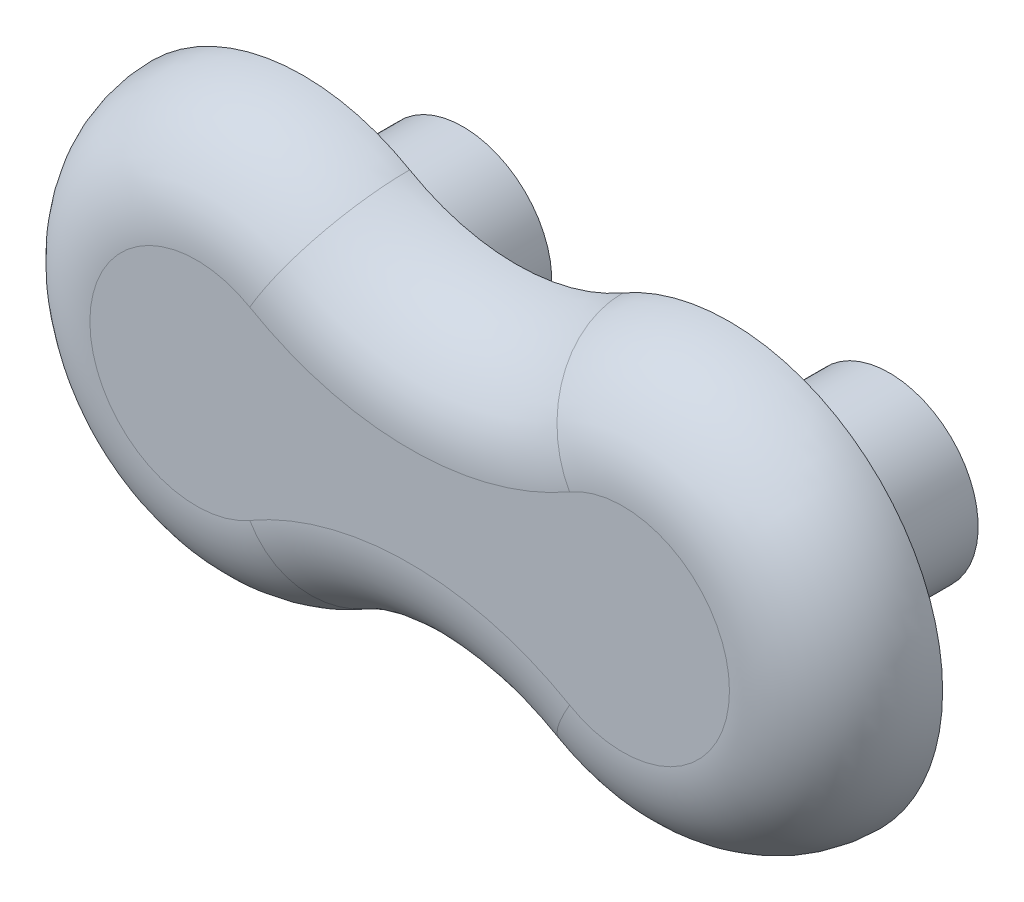
ISO-10303-21;
HEADER;
FILE_DESCRIPTION(('STEP AP214'),'2;1');
FILE_NAME('part.step','',(''),(''),'','','');
FILE_SCHEMA(('AUTOMOTIVE_DESIGN { 1 0 10303 214 1 1 1 1 }'));
ENDSEC;
DATA;
#1=APPLICATION_CONTEXT('core data for automotive mechanical design processes');
#2=APPLICATION_PROTOCOL_DEFINITION('international standard','automotive_design',2000,#1);
#3=PRODUCT_CONTEXT('',#1,'mechanical');
#4=PRODUCT('Part','Part','',(#3));
#5=PRODUCT_RELATED_PRODUCT_CATEGORY('part','',(#4));
#6=PRODUCT_DEFINITION_FORMATION('','',#4);
#7=PRODUCT_DEFINITION_CONTEXT('part definition',#1,'design');
#8=PRODUCT_DEFINITION('design','',#6,#7);
#9=PRODUCT_DEFINITION_SHAPE('','',#8);
#10=(LENGTH_UNIT() NAMED_UNIT(*) SI_UNIT(.MILLI.,.METRE.));
#11=(NAMED_UNIT(*) PLANE_ANGLE_UNIT() SI_UNIT($,.RADIAN.));
#12=(NAMED_UNIT(*) SI_UNIT($,.STERADIAN.) SOLID_ANGLE_UNIT());
#13=UNCERTAINTY_MEASURE_WITH_UNIT(LENGTH_MEASURE(1.E-05),#10,'distance_accuracy_value','');
#14=(GEOMETRIC_REPRESENTATION_CONTEXT(3) GLOBAL_UNCERTAINTY_ASSIGNED_CONTEXT((#13)) GLOBAL_UNIT_ASSIGNED_CONTEXT((#10,
#11,#12)) REPRESENTATION_CONTEXT('',''));
#15=CARTESIAN_POINT('',(0.,0.,0.));
#16=DIRECTION('',(0.,0.,1.));
#17=DIRECTION('',(1.,0.,0.));
#18=AXIS2_PLACEMENT_3D('',#15,#16,#17);
#19=CARTESIAN_POINT('',(15.,5.19615242270662,7.5));
#20=DIRECTION('',(0.,0.,1.));
#21=DIRECTION('',(1.,0.,0.));
#22=AXIS2_PLACEMENT_3D('',#19,#20,#21);
#23=PLANE('',#22);
#24=CARTESIAN_POINT('',(12.,10.3923048454133,7.5));
#25=DIRECTION('',(0.,0.,1.));
#26=DIRECTION('',(1.,0.,0.));
#27=AXIS2_PLACEMENT_3D('',#24,#25,#26);
#28=CIRCLE('',#27,9.);
#29=CARTESIAN_POINT('',(16.5,2.5980762113533,7.5));
#30=VERTEX_POINT('',#29);
#31=CARTESIAN_POINT('',(7.49999999999998,2.59807621135331,7.5));
#32=VERTEX_POINT('',#31);
#33=EDGE_CURVE('E53',#30,#32,#28,.F.);
#34=ORIENTED_EDGE('',*,*,#33,.T.);
#35=CARTESIAN_POINT('',(5.99999999999998,0.,7.5));
#36=DIRECTION('',(0.,0.,1.));
#37=DIRECTION('',(1.,0.,0.));
#38=AXIS2_PLACEMENT_3D('',#35,#36,#37);
#39=CIRCLE('',#38,3.);
#40=CARTESIAN_POINT('',(7.49999999999998,-2.59807621135332,7.5));
#41=VERTEX_POINT('',#40);
#42=EDGE_CURVE('E11',#32,#41,#39,.T.);
#43=ORIENTED_EDGE('',*,*,#42,.T.);
#44=CARTESIAN_POINT('',(12.,-10.3923048454133,7.5));
#45=DIRECTION('',(0.,0.,1.));
#46=DIRECTION('',(1.,0.,0.));
#47=AXIS2_PLACEMENT_3D('',#44,#45,#46);
#48=CIRCLE('',#47,9.);
#49=CARTESIAN_POINT('',(16.5,-2.59807621135332,7.5));
#50=VERTEX_POINT('',#49);
#51=EDGE_CURVE('E135',#41,#50,#48,.F.);
#52=ORIENTED_EDGE('',*,*,#51,.T.);
#53=CARTESIAN_POINT('',(18.,0.,7.5));
#54=DIRECTION('',(0.,0.,1.));
#55=DIRECTION('',(1.,0.,0.));
#56=AXIS2_PLACEMENT_3D('',#53,#54,#55);
#57=CIRCLE('',#56,3.);
#58=EDGE_CURVE('E64',#50,#30,#57,.T.);
#59=ORIENTED_EDGE('',*,*,#58,.T.);
#60=EDGE_LOOP('',(#34,#43,#52,#59));
#61=FACE_BOUND('',#60,.T.);
#62=ADVANCED_FACE('F43',(#61),#23,.T.);
#63=CARTESIAN_POINT('',(15.,5.19615242270662,4.5));
#64=DIRECTION('',(0.,0.,1.));
#65=DIRECTION('',(1.,0.,0.));
#66=AXIS2_PLACEMENT_3D('',#63,#64,#65);
#67=PLANE('',#66);
#68=CARTESIAN_POINT('',(5.99999999999999,0.,4.5));
#69=DIRECTION('',(0.,0.,1.));
#70=DIRECTION('',(1.,0.,0.));
#71=AXIS2_PLACEMENT_3D('',#68,#69,#70);
#72=CIRCLE('',#71,2.99999999999999);
#73=CARTESIAN_POINT('',(8.99999999999998,0.,4.5));
#74=VERTEX_POINT('',#73);
#75=EDGE_CURVE('E126',#74,#74,#72,.F.);
#76=ORIENTED_EDGE('',*,*,#75,.F.);
#77=EDGE_LOOP('',(#76));
#78=FACE_BOUND('',#77,.T.);
#79=CARTESIAN_POINT('',(18.,0.,4.5));
#80=DIRECTION('',(0.,0.,1.));
#81=DIRECTION('',(1.,0.,0.));
#82=AXIS2_PLACEMENT_3D('',#79,#80,#81);
#83=CIRCLE('',#82,2.99999999999999);
#84=CARTESIAN_POINT('',(21.,0.,4.5));
#85=VERTEX_POINT('',#84);
#86=EDGE_CURVE('E116',#85,#85,#83,.F.);
#87=ORIENTED_EDGE('',*,*,#86,.F.);
#88=EDGE_LOOP('',(#87));
#89=FACE_BOUND('',#88,.T.);
#90=CARTESIAN_POINT('',(12.,10.3923048454133,4.5));
#91=DIRECTION('',(0.,0.,-1.));
#92=DIRECTION('',(1.,0.,0.));
#93=AXIS2_PLACEMENT_3D('',#90,#91,#92);
#94=CIRCLE('',#93,6.);
#95=CARTESIAN_POINT('',(15.,5.19615242270662,4.5));
#96=VERTEX_POINT('',#95);
#97=CARTESIAN_POINT('',(8.99999999999999,5.19615242270663,4.5));
#98=VERTEX_POINT('',#97);
#99=EDGE_CURVE('E97',#96,#98,#94,.T.);
#100=ORIENTED_EDGE('',*,*,#99,.F.);
#101=CARTESIAN_POINT('',(18.,0.,4.5));
#102=DIRECTION('',(0.,0.,1.));
#103=DIRECTION('',(1.,0.,0.));
#104=AXIS2_PLACEMENT_3D('',#101,#102,#103);
#105=CIRCLE('',#104,6.);
#106=CARTESIAN_POINT('',(15.,-5.19615242270664,4.5));
#107=VERTEX_POINT('',#106);
#108=EDGE_CURVE('E110',#107,#96,#105,.T.);
#109=ORIENTED_EDGE('',*,*,#108,.F.);
#110=CARTESIAN_POINT('',(12.,-10.3923048454133,4.5));
#111=DIRECTION('',(0.,0.,-1.));
#112=DIRECTION('',(1.,0.,0.));
#113=AXIS2_PLACEMENT_3D('',#110,#111,#112);
#114=CIRCLE('',#113,6.);
#115=CARTESIAN_POINT('',(8.99999999999998,-5.19615242270663,4.5));
#116=VERTEX_POINT('',#115);
#117=EDGE_CURVE('E106',#116,#107,#114,.T.);
#118=ORIENTED_EDGE('',*,*,#117,.F.);
#119=CARTESIAN_POINT('',(5.99999999999998,0.,4.5));
#120=DIRECTION('',(0.,0.,1.));
#121=DIRECTION('',(1.,0.,0.));
#122=AXIS2_PLACEMENT_3D('',#119,#120,#121);
#123=CIRCLE('',#122,6.);
#124=EDGE_CURVE('E89',#98,#116,#123,.T.);
#125=ORIENTED_EDGE('',*,*,#124,.F.);
#126=EDGE_LOOP('',(#100,#109,#118,#125));
#127=FACE_BOUND('',#126,.T.);
#128=ADVANCED_FACE('F104',(#78,#89,#127),#67,.F.);
#129=CARTESIAN_POINT('',(18.,0.,4.));
#130=DIRECTION('',(0.,0.,1.));
#131=DIRECTION('',(1.,0.,0.));
#132=AXIS2_PLACEMENT_3D('',#129,#130,#131);
#133=CYLINDRICAL_SURFACE('',#132,2.99999999999999);
#134=CARTESIAN_POINT('',(18.,0.,4.));
#135=DIRECTION('',(0.,0.,-1.));
#136=DIRECTION('',(-1.,0.,0.));
#137=AXIS2_PLACEMENT_3D('',#134,#135,#136);
#138=CIRCLE('',#137,2.99999999999999);
#139=CARTESIAN_POINT('',(15.,0.,4.));
#140=VERTEX_POINT('',#139);
#141=EDGE_CURVE('E122',#140,#140,#138,.T.);
#142=ORIENTED_EDGE('',*,*,#141,.F.);
#143=EDGE_LOOP('',(#142));
#144=FACE_BOUND('',#143,.T.);
#145=ORIENTED_EDGE('',*,*,#86,.T.);
#146=EDGE_LOOP('',(#145));
#147=FACE_BOUND('',#146,.T.);
#148=ADVANCED_FACE('F185',(#144,#147),#133,.T.);
#149=CARTESIAN_POINT('',(18.,0.,4.));
#150=DIRECTION('',(0.,0.,-1.));
#151=DIRECTION('',(-1.,0.,0.));
#152=AXIS2_PLACEMENT_3D('',#149,#150,#151);
#153=PLANE('',#152);
#154=CARTESIAN_POINT('',(18.,0.,4.));
#155=DIRECTION('',(0.,0.,-1.));
#156=DIRECTION('',(-1.,0.,0.));
#157=AXIS2_PLACEMENT_3D('',#154,#155,#156);
#158=CIRCLE('',#157,2.49999999999999);
#159=CARTESIAN_POINT('',(15.5,0.,4.));
#160=VERTEX_POINT('',#159);
#161=EDGE_CURVE('E117',#160,#160,#158,.T.);
#162=ORIENTED_EDGE('',*,*,#161,.F.);
#163=EDGE_LOOP('',(#162));
#164=FACE_BOUND('',#163,.T.);
#165=ORIENTED_EDGE('',*,*,#141,.T.);
#166=EDGE_LOOP('',(#165));
#167=FACE_BOUND('',#166,.T.);
#168=ADVANCED_FACE('F178',(#164,#167),#153,.T.);
#169=CARTESIAN_POINT('',(18.,0.,0.));
#170=DIRECTION('',(0.,0.,-1.));
#171=DIRECTION('',(-1.,0.,0.));
#172=AXIS2_PLACEMENT_3D('',#169,#170,#171);
#173=PLANE('',#172);
#174=CARTESIAN_POINT('',(18.,0.,0.));
#175=DIRECTION('',(0.,0.,-1.));
#176=DIRECTION('',(-1.,0.,0.));
#177=AXIS2_PLACEMENT_3D('',#174,#175,#176);
#178=CIRCLE('',#177,2.49999999999999);
#179=CARTESIAN_POINT('',(15.5,0.,0.));
#180=VERTEX_POINT('',#179);
#181=EDGE_CURVE('E102',#180,#180,#178,.T.);
#182=ORIENTED_EDGE('',*,*,#181,.T.);
#183=EDGE_LOOP('',(#182));
#184=FACE_BOUND('',#183,.T.);
#185=ADVANCED_FACE('F164',(#184),#173,.T.);
#186=CARTESIAN_POINT('',(18.,0.,0.));
#187=DIRECTION('',(0.,0.,1.));
#188=DIRECTION('',(1.,0.,0.));
#189=AXIS2_PLACEMENT_3D('',#186,#187,#188);
#190=CYLINDRICAL_SURFACE('',#189,2.49999999999999);
#191=ORIENTED_EDGE('',*,*,#161,.T.);
#192=EDGE_LOOP('',(#191));
#193=FACE_BOUND('',#192,.T.);
#194=ORIENTED_EDGE('',*,*,#181,.F.);
#195=EDGE_LOOP('',(#194));
#196=FACE_BOUND('',#195,.T.);
#197=ADVANCED_FACE('F166',(#193,#196),#190,.T.);
#198=CARTESIAN_POINT('',(5.99999999999999,0.,4.));
#199=DIRECTION('',(0.,0.,1.));
#200=DIRECTION('',(1.,0.,0.));
#201=AXIS2_PLACEMENT_3D('',#198,#199,#200);
#202=CYLINDRICAL_SURFACE('',#201,2.99999999999999);
#203=CARTESIAN_POINT('',(5.99999999999999,0.,4.));
#204=DIRECTION('',(0.,0.,-1.));
#205=DIRECTION('',(-1.,0.,0.));
#206=AXIS2_PLACEMENT_3D('',#203,#204,#205);
#207=CIRCLE('',#206,2.99999999999999);
#208=CARTESIAN_POINT('',(3.,0.,4.));
#209=VERTEX_POINT('',#208);
#210=EDGE_CURVE('E131',#209,#209,#207,.T.);
#211=ORIENTED_EDGE('',*,*,#210,.F.);
#212=EDGE_LOOP('',(#211));
#213=FACE_BOUND('',#212,.T.);
#214=ORIENTED_EDGE('',*,*,#75,.T.);
#215=EDGE_LOOP('',(#214));
#216=FACE_BOUND('',#215,.T.);
#217=ADVANCED_FACE('F168',(#213,#216),#202,.T.);
#218=CARTESIAN_POINT('',(5.99999999999999,0.,4.));
#219=DIRECTION('',(0.,0.,-1.));
#220=DIRECTION('',(-1.,0.,0.));
#221=AXIS2_PLACEMENT_3D('',#218,#219,#220);
#222=PLANE('',#221);
#223=CARTESIAN_POINT('',(5.99999999999999,0.,4.));
#224=DIRECTION('',(0.,0.,-1.));
#225=DIRECTION('',(-1.,0.,0.));
#226=AXIS2_PLACEMENT_3D('',#223,#224,#225);
#227=CIRCLE('',#226,2.5);
#228=CARTESIAN_POINT('',(3.49999999999999,0.,4.));
#229=VERTEX_POINT('',#228);
#230=EDGE_CURVE('E127',#229,#229,#227,.T.);
#231=ORIENTED_EDGE('',*,*,#230,.F.);
#232=EDGE_LOOP('',(#231));
#233=FACE_BOUND('',#232,.T.);
#234=ORIENTED_EDGE('',*,*,#210,.T.);
#235=EDGE_LOOP('',(#234));
#236=FACE_BOUND('',#235,.T.);
#237=ADVANCED_FACE('F175',(#233,#236),#222,.T.);
#238=CARTESIAN_POINT('',(5.99999999999999,0.,0.));
#239=DIRECTION('',(0.,0.,-1.));
#240=DIRECTION('',(-1.,0.,0.));
#241=AXIS2_PLACEMENT_3D('',#238,#239,#240);
#242=PLANE('',#241);
#243=CARTESIAN_POINT('',(5.99999999999999,0.,0.));
#244=DIRECTION('',(0.,0.,-1.));
#245=DIRECTION('',(-1.,0.,0.));
#246=AXIS2_PLACEMENT_3D('',#243,#244,#245);
#247=CIRCLE('',#246,2.5);
#248=CARTESIAN_POINT('',(3.49999999999999,0.,0.));
#249=VERTEX_POINT('',#248);
#250=EDGE_CURVE('E121',#249,#249,#247,.T.);
#251=ORIENTED_EDGE('',*,*,#250,.T.);
#252=EDGE_LOOP('',(#251));
#253=FACE_BOUND('',#252,.T.);
#254=ADVANCED_FACE('F202',(#253),#242,.T.);
#255=CARTESIAN_POINT('',(5.99999999999999,0.,0.));
#256=DIRECTION('',(0.,0.,1.));
#257=DIRECTION('',(1.,0.,0.));
#258=AXIS2_PLACEMENT_3D('',#255,#256,#257);
#259=CYLINDRICAL_SURFACE('',#258,2.5);
#260=ORIENTED_EDGE('',*,*,#230,.T.);
#261=EDGE_LOOP('',(#260));
#262=FACE_BOUND('',#261,.T.);
#263=ORIENTED_EDGE('',*,*,#250,.F.);
#264=EDGE_LOOP('',(#263));
#265=FACE_BOUND('',#264,.T.);
#266=ADVANCED_FACE('F197',(#262,#265),#259,.T.);
#267=CARTESIAN_POINT('',(18.,0.,4.5));
#268=DIRECTION('',(0.,0.,1.));
#269=DIRECTION('',(1.,0.,0.));
#270=AXIS2_PLACEMENT_3D('',#267,#268,#269);
#271=TOROIDAL_SURFACE('',#270,3.,3.);
#272=CARTESIAN_POINT('',(16.5,-2.59807621135332,4.5));
#273=DIRECTION('',(-0.866025403784438,0.500000000000001,0.));
#274=DIRECTION('',(-0.500000000000001,-0.866025403784438,0.));
#275=AXIS2_PLACEMENT_3D('',#272,#273,#274);
#276=CIRCLE('',#275,3.);
#277=EDGE_CURVE('E93',#107,#50,#276,.T.);
#278=ORIENTED_EDGE('',*,*,#277,.F.);
#279=ORIENTED_EDGE('',*,*,#108,.T.);
#280=CARTESIAN_POINT('',(16.5,2.5980762113533,4.5));
#281=DIRECTION('',(-0.866025403784439,-0.499999999999999,0.));
#282=DIRECTION('',(0.499999999999999,-0.866025403784439,0.));
#283=AXIS2_PLACEMENT_3D('',#280,#281,#282);
#284=CIRCLE('',#283,3.);
#285=EDGE_CURVE('E47',#30,#96,#284,.T.);
#286=ORIENTED_EDGE('',*,*,#285,.F.);
#287=ORIENTED_EDGE('',*,*,#58,.F.);
#288=EDGE_LOOP('',(#278,#279,#286,#287));
#289=FACE_BOUND('',#288,.T.);
#290=ADVANCED_FACE('F45',(#289),#271,.T.);
#291=CARTESIAN_POINT('',(12.,10.3923048454133,4.5));
#292=DIRECTION('',(0.,0.,1.));
#293=DIRECTION('',(1.,0.,0.));
#294=AXIS2_PLACEMENT_3D('',#291,#292,#293);
#295=TOROIDAL_SURFACE('',#294,9.,3.);
#296=ORIENTED_EDGE('',*,*,#285,.T.);
#297=ORIENTED_EDGE('',*,*,#99,.T.);
#298=CARTESIAN_POINT('',(7.49999999999998,2.59807621135331,4.5));
#299=DIRECTION('',(-0.866025403784438,0.500000000000001,0.));
#300=DIRECTION('',(-0.500000000000001,-0.866025403784438,0.));
#301=AXIS2_PLACEMENT_3D('',#298,#299,#300);
#302=CIRCLE('',#301,3.);
#303=EDGE_CURVE('E85',#32,#98,#302,.T.);
#304=ORIENTED_EDGE('',*,*,#303,.F.);
#305=ORIENTED_EDGE('',*,*,#33,.F.);
#306=EDGE_LOOP('',(#296,#297,#304,#305));
#307=FACE_BOUND('',#306,.T.);
#308=ADVANCED_FACE('F98',(#307),#295,.T.);
#309=CARTESIAN_POINT('',(12.,-10.3923048454133,4.5));
#310=DIRECTION('',(0.,0.,1.));
#311=DIRECTION('',(1.,0.,0.));
#312=AXIS2_PLACEMENT_3D('',#309,#310,#311);
#313=TOROIDAL_SURFACE('',#312,9.,3.);
#314=ORIENTED_EDGE('',*,*,#277,.T.);
#315=ORIENTED_EDGE('',*,*,#51,.F.);
#316=CARTESIAN_POINT('',(7.49999999999998,-2.59807621135332,4.5));
#317=DIRECTION('',(-0.866025403784438,-0.5,0.));
#318=DIRECTION('',(0.5,-0.866025403784439,0.));
#319=AXIS2_PLACEMENT_3D('',#316,#317,#318);
#320=CIRCLE('',#319,3.);
#321=EDGE_CURVE('E94',#116,#41,#320,.T.);
#322=ORIENTED_EDGE('',*,*,#321,.F.);
#323=ORIENTED_EDGE('',*,*,#117,.T.);
#324=EDGE_LOOP('',(#314,#315,#322,#323));
#325=FACE_BOUND('',#324,.T.);
#326=ADVANCED_FACE('F191',(#325),#313,.T.);
#327=CARTESIAN_POINT('',(5.99999999999998,0.,4.5));
#328=DIRECTION('',(0.,0.,1.));
#329=DIRECTION('',(1.,0.,0.));
#330=AXIS2_PLACEMENT_3D('',#327,#328,#329);
#331=DEGENERATE_TOROIDAL_SURFACE('',#330,3.,3.,.T.);
#332=ORIENTED_EDGE('',*,*,#303,.T.);
#333=ORIENTED_EDGE('',*,*,#124,.T.);
#334=ORIENTED_EDGE('',*,*,#321,.T.);
#335=ORIENTED_EDGE('',*,*,#42,.F.);
#336=EDGE_LOOP('',(#332,#333,#334,#335));
#337=FACE_BOUND('',#336,.T.);
#338=ADVANCED_FACE('F87',(#337),#331,.T.);
#339=CLOSED_SHELL('',(#62,#128,#148,#168,#185,#197,#217,#237,#254,#266,#290,#308,#326,#338));
#340=MANIFOLD_SOLID_BREP('B2',#339);
#341=ADVANCED_BREP_SHAPE_REPRESENTATION('',(#18,#340),#14);
#342=SHAPE_DEFINITION_REPRESENTATION(#9,#341);
ENDSEC;
END-ISO-10303-21;
